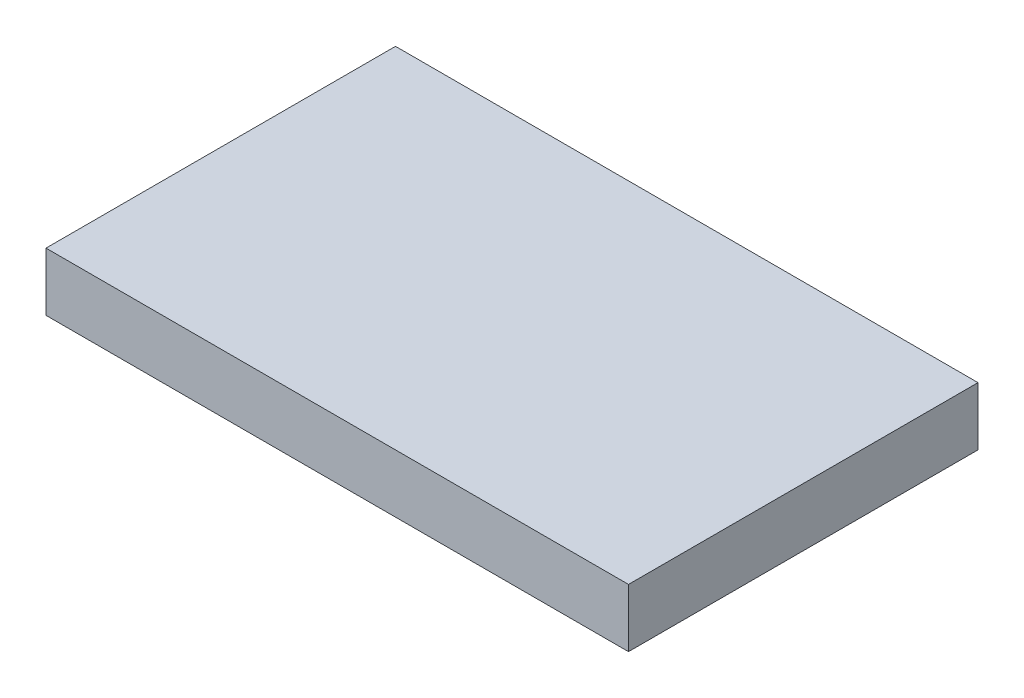
ISO-10303-21;
HEADER;
FILE_DESCRIPTION(('STEP AP214'),'2;1');
FILE_NAME('part.step','',(''),(''),'','','');
FILE_SCHEMA(('AUTOMOTIVE_DESIGN { 1 0 10303 214 1 1 1 1 }'));
ENDSEC;
DATA;
#1=APPLICATION_CONTEXT('core data for automotive mechanical design processes');
#2=APPLICATION_PROTOCOL_DEFINITION('international standard','automotive_design',2000,#1);
#3=PRODUCT_CONTEXT('',#1,'mechanical');
#4=PRODUCT('Part','Part','',(#3));
#5=PRODUCT_RELATED_PRODUCT_CATEGORY('part','',(#4));
#6=PRODUCT_DEFINITION_FORMATION('','',#4);
#7=PRODUCT_DEFINITION_CONTEXT('part definition',#1,'design');
#8=PRODUCT_DEFINITION('design','',#6,#7);
#9=PRODUCT_DEFINITION_SHAPE('','',#8);
#10=(LENGTH_UNIT() NAMED_UNIT(*) SI_UNIT(.MILLI.,.METRE.));
#11=(NAMED_UNIT(*) PLANE_ANGLE_UNIT() SI_UNIT($,.RADIAN.));
#12=(NAMED_UNIT(*) SI_UNIT($,.STERADIAN.) SOLID_ANGLE_UNIT());
#13=UNCERTAINTY_MEASURE_WITH_UNIT(LENGTH_MEASURE(1.E-05),#10,'distance_accuracy_value','');
#14=(GEOMETRIC_REPRESENTATION_CONTEXT(3) GLOBAL_UNCERTAINTY_ASSIGNED_CONTEXT((#13)) GLOBAL_UNIT_ASSIGNED_CONTEXT((#10,
#11,#12)) REPRESENTATION_CONTEXT('',''));
#15=CARTESIAN_POINT('',(0.,0.,0.));
#16=DIRECTION('',(0.,0.,1.));
#17=DIRECTION('',(1.,0.,0.));
#18=AXIS2_PLACEMENT_3D('',#15,#16,#17);
#19=CARTESIAN_POINT('',(2.6888888888889,12.3555555555555,3.25));
#20=DIRECTION('',(1.,0.,0.));
#21=DIRECTION('',(0.,1.,0.));
#22=AXIS2_PLACEMENT_3D('',#19,#20,#21);
#23=PLANE('',#22);
#24=DIRECTION('',(0.,0.,-1.));
#25=VECTOR('',#24,1.);
#26=CARTESIAN_POINT('',(2.6888888888889,13.3555555555555,3.25));
#27=LINE('',#26,#25);
#28=CARTESIAN_POINT('',(2.6888888888889,13.3555555555555,3.25));
#29=VERTEX_POINT('',#28);
#30=CARTESIAN_POINT('',(2.6888888888889,13.3555555555556,-2.75));
#31=VERTEX_POINT('',#30);
#32=EDGE_CURVE('E98',#29,#31,#27,.T.);
#33=ORIENTED_EDGE('',*,*,#32,.T.);
#34=DIRECTION('',(0.,1.,0.));
#35=VECTOR('',#34,1.);
#36=CARTESIAN_POINT('',(2.6888888888889,12.3555555555556,-2.75));
#37=LINE('',#36,#35);
#38=CARTESIAN_POINT('',(2.6888888888889,12.3555555555556,-2.75));
#39=VERTEX_POINT('',#38);
#40=EDGE_CURVE('E11',#39,#31,#37,.T.);
#41=ORIENTED_EDGE('',*,*,#40,.F.);
#42=DIRECTION('',(0.,0.,-1.));
#43=VECTOR('',#42,1.);
#44=CARTESIAN_POINT('',(2.6888888888889,12.3555555555555,3.25));
#45=LINE('',#44,#43);
#46=CARTESIAN_POINT('',(2.6888888888889,12.3555555555555,3.25));
#47=VERTEX_POINT('',#46);
#48=EDGE_CURVE('E86',#47,#39,#45,.T.);
#49=ORIENTED_EDGE('',*,*,#48,.F.);
#50=DIRECTION('',(0.,1.,0.));
#51=VECTOR('',#50,1.);
#52=CARTESIAN_POINT('',(2.6888888888889,12.3555555555555,3.25));
#53=LINE('',#52,#51);
#54=EDGE_CURVE('E94',#47,#29,#53,.T.);
#55=ORIENTED_EDGE('',*,*,#54,.T.);
#56=EDGE_LOOP('',(#33,#41,#49,#55));
#57=FACE_BOUND('',#56,.T.);
#58=ADVANCED_FACE('F35',(#57),#23,.F.);
#59=CARTESIAN_POINT('',(2.6888888888889,12.3555555555556,-2.75));
#60=DIRECTION('',(0.,0.,1.));
#61=DIRECTION('',(0.,-1.,0.));
#62=AXIS2_PLACEMENT_3D('',#59,#60,#61);
#63=PLANE('',#62);
#64=DIRECTION('',(1.,0.,0.));
#65=VECTOR('',#64,1.);
#66=CARTESIAN_POINT('',(2.6888888888889,13.3555555555556,-2.75));
#67=LINE('',#66,#65);
#68=CARTESIAN_POINT('',(12.6888888888889,13.3555555555556,-2.75));
#69=VERTEX_POINT('',#68);
#70=EDGE_CURVE('E90',#31,#69,#67,.T.);
#71=ORIENTED_EDGE('',*,*,#70,.T.);
#72=DIRECTION('',(0.,1.,0.));
#73=VECTOR('',#72,1.);
#74=CARTESIAN_POINT('',(12.6888888888889,12.3555555555556,-2.75));
#75=LINE('',#74,#73);
#76=CARTESIAN_POINT('',(12.6888888888889,12.3555555555556,-2.75));
#77=VERTEX_POINT('',#76);
#78=EDGE_CURVE('E43',#77,#69,#75,.T.);
#79=ORIENTED_EDGE('',*,*,#78,.F.);
#80=DIRECTION('',(1.,0.,0.));
#81=VECTOR('',#80,1.);
#82=CARTESIAN_POINT('',(2.6888888888889,12.3555555555556,-2.75));
#83=LINE('',#82,#81);
#84=EDGE_CURVE('E81',#39,#77,#83,.T.);
#85=ORIENTED_EDGE('',*,*,#84,.F.);
#86=ORIENTED_EDGE('',*,*,#40,.T.);
#87=EDGE_LOOP('',(#71,#79,#85,#86));
#88=FACE_BOUND('',#87,.T.);
#89=ADVANCED_FACE('F89',(#88),#63,.F.);
#90=CARTESIAN_POINT('',(12.6888888888889,12.3555555555555,3.25));
#91=DIRECTION('',(-1.,0.,0.));
#92=DIRECTION('',(0.,0.,-1.));
#93=AXIS2_PLACEMENT_3D('',#90,#91,#92);
#94=PLANE('',#93);
#95=DIRECTION('',(0.,0.,1.));
#96=VECTOR('',#95,1.);
#97=CARTESIAN_POINT('',(12.6888888888889,13.3555555555555,3.25));
#98=LINE('',#97,#96);
#99=CARTESIAN_POINT('',(12.6888888888889,13.3555555555555,3.25));
#100=VERTEX_POINT('',#99);
#101=EDGE_CURVE('E68',#69,#100,#98,.T.);
#102=ORIENTED_EDGE('',*,*,#101,.T.);
#103=DIRECTION('',(0.,1.,0.));
#104=VECTOR('',#103,1.);
#105=CARTESIAN_POINT('',(12.6888888888889,12.3555555555555,3.25));
#106=LINE('',#105,#104);
#107=CARTESIAN_POINT('',(12.6888888888889,12.3555555555555,3.25));
#108=VERTEX_POINT('',#107);
#109=EDGE_CURVE('E91',#108,#100,#106,.T.);
#110=ORIENTED_EDGE('',*,*,#109,.F.);
#111=DIRECTION('',(0.,0.,1.));
#112=VECTOR('',#111,1.);
#113=CARTESIAN_POINT('',(12.6888888888889,12.3555555555555,3.25));
#114=LINE('',#113,#112);
#115=EDGE_CURVE('E84',#77,#108,#114,.T.);
#116=ORIENTED_EDGE('',*,*,#115,.F.);
#117=ORIENTED_EDGE('',*,*,#78,.T.);
#118=EDGE_LOOP('',(#102,#110,#116,#117));
#119=FACE_BOUND('',#118,.T.);
#120=ADVANCED_FACE('F92',(#119),#94,.F.);
#121=CARTESIAN_POINT('',(2.6888888888889,12.3555555555555,3.25));
#122=DIRECTION('',(0.,0.,-1.));
#123=DIRECTION('',(0.,1.,0.));
#124=AXIS2_PLACEMENT_3D('',#121,#122,#123);
#125=PLANE('',#124);
#126=DIRECTION('',(-1.,0.,0.));
#127=VECTOR('',#126,1.);
#128=CARTESIAN_POINT('',(2.6888888888889,13.3555555555555,3.25));
#129=LINE('',#128,#127);
#130=EDGE_CURVE('E74',#100,#29,#129,.T.);
#131=ORIENTED_EDGE('',*,*,#130,.T.);
#132=ORIENTED_EDGE('',*,*,#54,.F.);
#133=DIRECTION('',(-1.,0.,0.));
#134=VECTOR('',#133,1.);
#135=CARTESIAN_POINT('',(2.6888888888889,12.3555555555555,3.25));
#136=LINE('',#135,#134);
#137=EDGE_CURVE('E51',#108,#47,#136,.T.);
#138=ORIENTED_EDGE('',*,*,#137,.F.);
#139=ORIENTED_EDGE('',*,*,#109,.T.);
#140=EDGE_LOOP('',(#131,#132,#138,#139));
#141=FACE_BOUND('',#140,.T.);
#142=ADVANCED_FACE('F105',(#141),#125,.F.);
#143=CARTESIAN_POINT('',(0.,12.3555555555556,-12.8555555555556));
#144=DIRECTION('',(0.,-1.,0.));
#145=DIRECTION('',(1.,0.,0.));
#146=AXIS2_PLACEMENT_3D('',#143,#144,#145);
#147=PLANE('',#146);
#148=ORIENTED_EDGE('',*,*,#48,.T.);
#149=ORIENTED_EDGE('',*,*,#84,.T.);
#150=ORIENTED_EDGE('',*,*,#115,.T.);
#151=ORIENTED_EDGE('',*,*,#137,.T.);
#152=EDGE_LOOP('',(#148,#149,#150,#151));
#153=FACE_BOUND('',#152,.T.);
#154=ADVANCED_FACE('F82',(#153),#147,.T.);
#155=CARTESIAN_POINT('',(0.,13.3555555555556,-12.8555555555555));
#156=DIRECTION('',(0.,-1.,0.));
#157=DIRECTION('',(1.,0.,0.));
#158=AXIS2_PLACEMENT_3D('',#155,#156,#157);
#159=PLANE('',#158);
#160=ORIENTED_EDGE('',*,*,#32,.F.);
#161=ORIENTED_EDGE('',*,*,#130,.F.);
#162=ORIENTED_EDGE('',*,*,#101,.F.);
#163=ORIENTED_EDGE('',*,*,#70,.F.);
#164=EDGE_LOOP('',(#160,#161,#162,#163));
#165=FACE_BOUND('',#164,.T.);
#166=ADVANCED_FACE('F108',(#165),#159,.F.);
#167=CLOSED_SHELL('',(#58,#89,#120,#142,#154,#166));
#168=MANIFOLD_SOLID_BREP('B2',#167);
#169=ADVANCED_BREP_SHAPE_REPRESENTATION('',(#18,#168),#14);
#170=SHAPE_DEFINITION_REPRESENTATION(#9,#169);
ENDSEC;
END-ISO-10303-21;
